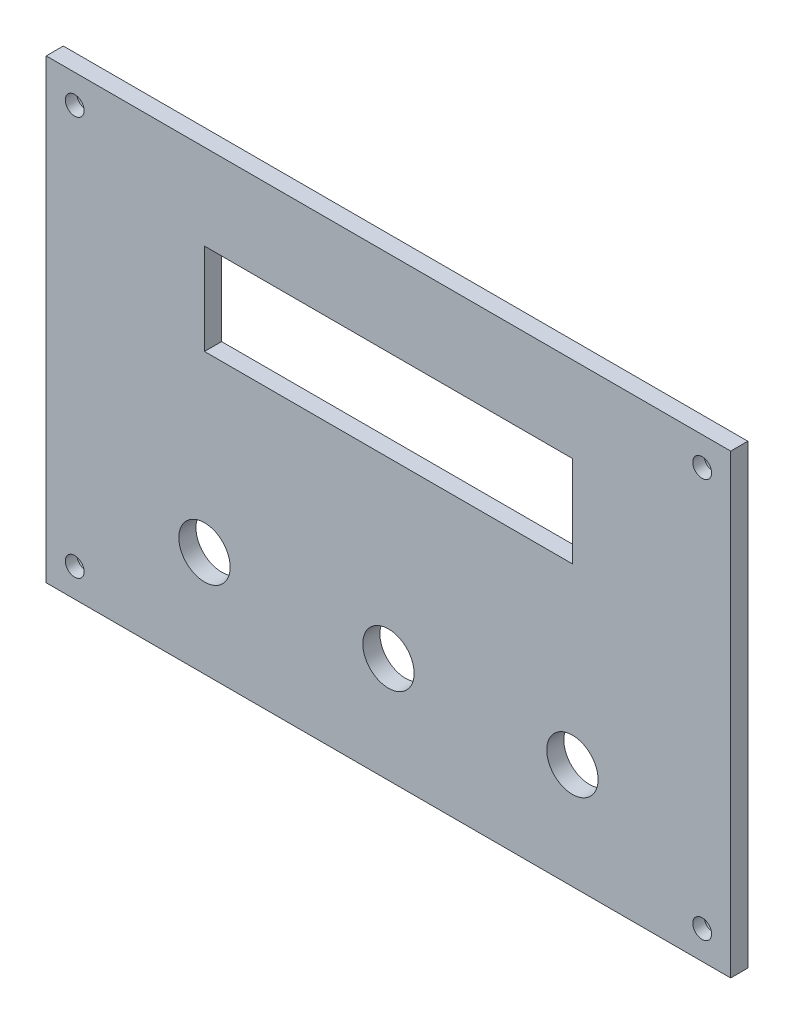
ISO-10303-21;
HEADER;
FILE_DESCRIPTION(('STEP AP214'),'2;1');
FILE_NAME('part.step','',(''),(''),'','','');
FILE_SCHEMA(('AUTOMOTIVE_DESIGN { 1 0 10303 214 1 1 1 1 }'));
ENDSEC;
DATA;
#1=APPLICATION_CONTEXT('core data for automotive mechanical design processes');
#2=APPLICATION_PROTOCOL_DEFINITION('international standard','automotive_design',2000,#1);
#3=PRODUCT_CONTEXT('',#1,'mechanical');
#4=PRODUCT('Part','Part','',(#3));
#5=PRODUCT_RELATED_PRODUCT_CATEGORY('part','',(#4));
#6=PRODUCT_DEFINITION_FORMATION('','',#4);
#7=PRODUCT_DEFINITION_CONTEXT('part definition',#1,'design');
#8=PRODUCT_DEFINITION('design','',#6,#7);
#9=PRODUCT_DEFINITION_SHAPE('','',#8);
#10=(LENGTH_UNIT() NAMED_UNIT(*) SI_UNIT(.MILLI.,.METRE.));
#11=(NAMED_UNIT(*) PLANE_ANGLE_UNIT() SI_UNIT($,.RADIAN.));
#12=(NAMED_UNIT(*) SI_UNIT($,.STERADIAN.) SOLID_ANGLE_UNIT());
#13=UNCERTAINTY_MEASURE_WITH_UNIT(LENGTH_MEASURE(1.E-05),#10,'distance_accuracy_value','');
#14=(GEOMETRIC_REPRESENTATION_CONTEXT(3) GLOBAL_UNCERTAINTY_ASSIGNED_CONTEXT((#13)) GLOBAL_UNIT_ASSIGNED_CONTEXT((#10,
#11,#12)) REPRESENTATION_CONTEXT('',''));
#15=CARTESIAN_POINT('',(0.,0.,0.));
#16=DIRECTION('',(0.,0.,1.));
#17=DIRECTION('',(1.,0.,0.));
#18=AXIS2_PLACEMENT_3D('',#15,#16,#17);
#19=CARTESIAN_POINT('',(0.,0.,3.));
#20=DIRECTION('',(0.,0.,1.));
#21=DIRECTION('',(1.,0.,0.));
#22=AXIS2_PLACEMENT_3D('',#19,#20,#21);
#23=PLANE('',#22);
#24=CARTESIAN_POINT('',(-55.,-35.,3.));
#25=DIRECTION('',(0.,0.,1.));
#26=DIRECTION('',(1.,0.,0.));
#27=AXIS2_PLACEMENT_3D('',#24,#25,#26);
#28=CIRCLE('',#27,1.65);
#29=CARTESIAN_POINT('',(-53.35,-35.,3.));
#30=VERTEX_POINT('',#29);
#31=EDGE_CURVE('E546',#30,#30,#28,.T.);
#32=ORIENTED_EDGE('',*,*,#31,.F.);
#33=EDGE_LOOP('',(#32));
#34=FACE_BOUND('',#33,.T.);
#35=CARTESIAN_POINT('',(55.,-35.,3.));
#36=DIRECTION('',(0.,0.,1.));
#37=DIRECTION('',(1.,0.,0.));
#38=AXIS2_PLACEMENT_3D('',#35,#36,#37);
#39=CIRCLE('',#38,1.65);
#40=CARTESIAN_POINT('',(56.65,-35.,3.));
#41=VERTEX_POINT('',#40);
#42=EDGE_CURVE('E537',#41,#41,#39,.T.);
#43=ORIENTED_EDGE('',*,*,#42,.F.);
#44=EDGE_LOOP('',(#43));
#45=FACE_BOUND('',#44,.T.);
#46=CARTESIAN_POINT('',(55.,35.,3.));
#47=DIRECTION('',(0.,0.,1.));
#48=DIRECTION('',(1.,0.,0.));
#49=AXIS2_PLACEMENT_3D('',#46,#47,#48);
#50=CIRCLE('',#49,1.65);
#51=CARTESIAN_POINT('',(56.65,35.,3.));
#52=VERTEX_POINT('',#51);
#53=EDGE_CURVE('E532',#52,#52,#50,.T.);
#54=ORIENTED_EDGE('',*,*,#53,.F.);
#55=EDGE_LOOP('',(#54));
#56=FACE_BOUND('',#55,.T.);
#57=CARTESIAN_POINT('',(-55.,35.,3.));
#58=DIRECTION('',(0.,0.,1.));
#59=DIRECTION('',(1.,0.,0.));
#60=AXIS2_PLACEMENT_3D('',#57,#58,#59);
#61=CIRCLE('',#60,1.65);
#62=CARTESIAN_POINT('',(-53.35,35.,3.));
#63=VERTEX_POINT('',#62);
#64=EDGE_CURVE('E536',#63,#63,#61,.T.);
#65=ORIENTED_EDGE('',*,*,#64,.F.);
#66=EDGE_LOOP('',(#65));
#67=FACE_BOUND('',#66,.T.);
#68=CARTESIAN_POINT('',(0.,-21.5,3.));
#69=DIRECTION('',(0.,0.,1.));
#70=DIRECTION('',(1.,0.,0.));
#71=AXIS2_PLACEMENT_3D('',#68,#69,#70);
#72=CIRCLE('',#71,4.5);
#73=CARTESIAN_POINT('',(4.5,-21.5,3.));
#74=VERTEX_POINT('',#73);
#75=EDGE_CURVE('E577',#74,#74,#72,.T.);
#76=ORIENTED_EDGE('',*,*,#75,.F.);
#77=EDGE_LOOP('',(#76));
#78=FACE_BOUND('',#77,.T.);
#79=DIRECTION('',(-1.,0.,0.));
#80=VECTOR('',#79,1.);
#81=CARTESIAN_POINT('',(-32.25,25.,3.));
#82=LINE('',#81,#80);
#83=CARTESIAN_POINT('',(32.25,25.,3.));
#84=VERTEX_POINT('',#83);
#85=CARTESIAN_POINT('',(-32.25,25.,3.));
#86=VERTEX_POINT('',#85);
#87=EDGE_CURVE('E119',#84,#86,#82,.T.);
#88=ORIENTED_EDGE('',*,*,#87,.F.);
#89=DIRECTION('',(0.,1.,0.));
#90=VECTOR('',#89,1.);
#91=CARTESIAN_POINT('',(32.25,25.,3.));
#92=LINE('',#91,#90);
#93=CARTESIAN_POINT('',(32.25,9.00000000000001,3.));
#94=VERTEX_POINT('',#93);
#95=EDGE_CURVE('E110',#94,#84,#92,.T.);
#96=ORIENTED_EDGE('',*,*,#95,.F.);
#97=DIRECTION('',(1.,0.,0.));
#98=VECTOR('',#97,1.);
#99=CARTESIAN_POINT('',(-32.25,9.00000000000001,3.));
#100=LINE('',#99,#98);
#101=CARTESIAN_POINT('',(-32.25,9.00000000000001,3.));
#102=VERTEX_POINT('',#101);
#103=EDGE_CURVE('E137',#102,#94,#100,.T.);
#104=ORIENTED_EDGE('',*,*,#103,.F.);
#105=DIRECTION('',(0.,-1.,0.));
#106=VECTOR('',#105,1.);
#107=CARTESIAN_POINT('',(-32.25,25.,3.));
#108=LINE('',#107,#106);
#109=EDGE_CURVE('E133',#86,#102,#108,.T.);
#110=ORIENTED_EDGE('',*,*,#109,.F.);
#111=EDGE_LOOP('',(#88,#96,#104,#110));
#112=FACE_BOUND('',#111,.T.);
#113=DIRECTION('',(0.,-1.,0.));
#114=VECTOR('',#113,1.);
#115=CARTESIAN_POINT('',(-60.,40.,3.));
#116=LINE('',#115,#114);
#117=CARTESIAN_POINT('',(-60.,40.,3.));
#118=VERTEX_POINT('',#117);
#119=CARTESIAN_POINT('',(-60.,-40.,3.));
#120=VERTEX_POINT('',#119);
#121=EDGE_CURVE('E161',#118,#120,#116,.T.);
#122=ORIENTED_EDGE('',*,*,#121,.T.);
#123=DIRECTION('',(1.,0.,0.));
#124=VECTOR('',#123,1.);
#125=CARTESIAN_POINT('',(-60.,-40.,3.));
#126=LINE('',#125,#124);
#127=CARTESIAN_POINT('',(60.,-40.,3.));
#128=VERTEX_POINT('',#127);
#129=EDGE_CURVE('E165',#120,#128,#126,.T.);
#130=ORIENTED_EDGE('',*,*,#129,.T.);
#131=DIRECTION('',(0.,-1.,0.));
#132=VECTOR('',#131,1.);
#133=CARTESIAN_POINT('',(60.,40.,3.));
#134=LINE('',#133,#132);
#135=CARTESIAN_POINT('',(60.,40.,3.));
#136=VERTEX_POINT('',#135);
#137=EDGE_CURVE('E169',#136,#128,#134,.T.);
#138=ORIENTED_EDGE('',*,*,#137,.F.);
#139=DIRECTION('',(1.,0.,0.));
#140=VECTOR('',#139,1.);
#141=CARTESIAN_POINT('',(-60.,40.,3.));
#142=LINE('',#141,#140);
#143=EDGE_CURVE('E173',#118,#136,#142,.T.);
#144=ORIENTED_EDGE('',*,*,#143,.F.);
#145=EDGE_LOOP('',(#122,#130,#138,#144));
#146=FACE_BOUND('',#145,.T.);
#147=CARTESIAN_POINT('',(32.25,-21.5,3.));
#148=DIRECTION('',(0.,0.,1.));
#149=DIRECTION('',(1.,0.,0.));
#150=AXIS2_PLACEMENT_3D('',#147,#148,#149);
#151=CIRCLE('',#150,4.5);
#152=CARTESIAN_POINT('',(36.75,-21.5,3.));
#153=VERTEX_POINT('',#152);
#154=EDGE_CURVE('E562',#153,#153,#151,.T.);
#155=ORIENTED_EDGE('',*,*,#154,.F.);
#156=EDGE_LOOP('',(#155));
#157=FACE_BOUND('',#156,.T.);
#158=CARTESIAN_POINT('',(-32.25,-21.5,3.));
#159=DIRECTION('',(0.,0.,1.));
#160=DIRECTION('',(1.,0.,0.));
#161=AXIS2_PLACEMENT_3D('',#158,#159,#160);
#162=CIRCLE('',#161,4.5);
#163=CARTESIAN_POINT('',(-27.75,-21.5,3.));
#164=VERTEX_POINT('',#163);
#165=EDGE_CURVE('E145',#164,#164,#162,.T.);
#166=ORIENTED_EDGE('',*,*,#165,.F.);
#167=EDGE_LOOP('',(#166));
#168=FACE_BOUND('',#167,.T.);
#169=ADVANCED_FACE('F44',(#34,#45,#56,#67,#78,#112,#146,#157,#168),#23,.T.);
#170=CARTESIAN_POINT('',(0.,0.,0.));
#171=DIRECTION('',(0.,0.,1.));
#172=DIRECTION('',(1.,0.,0.));
#173=AXIS2_PLACEMENT_3D('',#170,#171,#172);
#174=PLANE('',#173);
#175=CARTESIAN_POINT('',(55.,-35.,0.));
#176=DIRECTION('',(0.,0.,1.));
#177=DIRECTION('',(1.,0.,0.));
#178=AXIS2_PLACEMENT_3D('',#175,#176,#177);
#179=CIRCLE('',#178,2.5);
#180=CARTESIAN_POINT('',(57.5,-35.,0.));
#181=VERTEX_POINT('',#180);
#182=EDGE_CURVE('E511',#181,#181,#179,.T.);
#183=ORIENTED_EDGE('',*,*,#182,.T.);
#184=EDGE_LOOP('',(#183));
#185=FACE_BOUND('',#184,.T.);
#186=CARTESIAN_POINT('',(-55.,-35.,0.));
#187=DIRECTION('',(0.,0.,1.));
#188=DIRECTION('',(1.,0.,0.));
#189=AXIS2_PLACEMENT_3D('',#186,#187,#188);
#190=CIRCLE('',#189,2.5);
#191=CARTESIAN_POINT('',(-52.5,-35.,0.));
#192=VERTEX_POINT('',#191);
#193=EDGE_CURVE('E510',#192,#192,#190,.T.);
#194=ORIENTED_EDGE('',*,*,#193,.T.);
#195=EDGE_LOOP('',(#194));
#196=FACE_BOUND('',#195,.T.);
#197=CARTESIAN_POINT('',(-55.,35.,0.));
#198=DIRECTION('',(0.,0.,1.));
#199=DIRECTION('',(1.,0.,0.));
#200=AXIS2_PLACEMENT_3D('',#197,#198,#199);
#201=CIRCLE('',#200,2.5);
#202=CARTESIAN_POINT('',(-52.5,35.,0.));
#203=VERTEX_POINT('',#202);
#204=EDGE_CURVE('E591',#203,#203,#201,.T.);
#205=ORIENTED_EDGE('',*,*,#204,.T.);
#206=EDGE_LOOP('',(#205));
#207=FACE_BOUND('',#206,.T.);
#208=CARTESIAN_POINT('',(55.,35.,0.));
#209=DIRECTION('',(0.,0.,1.));
#210=DIRECTION('',(1.,0.,0.));
#211=AXIS2_PLACEMENT_3D('',#208,#209,#210);
#212=CIRCLE('',#211,2.5);
#213=CARTESIAN_POINT('',(57.5,35.,0.));
#214=VERTEX_POINT('',#213);
#215=EDGE_CURVE('E522',#214,#214,#212,.T.);
#216=ORIENTED_EDGE('',*,*,#215,.T.);
#217=EDGE_LOOP('',(#216));
#218=FACE_BOUND('',#217,.T.);
#219=DIRECTION('',(0.,-1.,0.));
#220=VECTOR('',#219,1.);
#221=CARTESIAN_POINT('',(-60.,40.,0.));
#222=LINE('',#221,#220);
#223=CARTESIAN_POINT('',(-60.,40.,0.));
#224=VERTEX_POINT('',#223);
#225=CARTESIAN_POINT('',(-60.,-40.,0.));
#226=VERTEX_POINT('',#225);
#227=EDGE_CURVE('E128',#224,#226,#222,.T.);
#228=ORIENTED_EDGE('',*,*,#227,.F.);
#229=DIRECTION('',(1.,0.,0.));
#230=VECTOR('',#229,1.);
#231=CARTESIAN_POINT('',(-60.,40.,0.));
#232=LINE('',#231,#230);
#233=CARTESIAN_POINT('',(60.,40.,0.));
#234=VERTEX_POINT('',#233);
#235=EDGE_CURVE('E166',#224,#234,#232,.T.);
#236=ORIENTED_EDGE('',*,*,#235,.T.);
#237=DIRECTION('',(0.,-1.,0.));
#238=VECTOR('',#237,1.);
#239=CARTESIAN_POINT('',(60.,40.,0.));
#240=LINE('',#239,#238);
#241=CARTESIAN_POINT('',(60.,-40.,0.));
#242=VERTEX_POINT('',#241);
#243=EDGE_CURVE('E185',#234,#242,#240,.T.);
#244=ORIENTED_EDGE('',*,*,#243,.T.);
#245=DIRECTION('',(1.,0.,0.));
#246=VECTOR('',#245,1.);
#247=CARTESIAN_POINT('',(-60.,-40.,0.));
#248=LINE('',#247,#246);
#249=EDGE_CURVE('E181',#226,#242,#248,.T.);
#250=ORIENTED_EDGE('',*,*,#249,.F.);
#251=EDGE_LOOP('',(#228,#236,#244,#250));
#252=FACE_BOUND('',#251,.T.);
#253=DIRECTION('',(0.,1.,0.));
#254=VECTOR('',#253,1.);
#255=CARTESIAN_POINT('',(32.25,25.,0.));
#256=LINE('',#255,#254);
#257=CARTESIAN_POINT('',(32.25,9.00000000000001,0.));
#258=VERTEX_POINT('',#257);
#259=CARTESIAN_POINT('',(32.25,25.,0.));
#260=VERTEX_POINT('',#259);
#261=EDGE_CURVE('E68',#258,#260,#256,.T.);
#262=ORIENTED_EDGE('',*,*,#261,.T.);
#263=DIRECTION('',(-1.,0.,0.));
#264=VECTOR('',#263,1.);
#265=CARTESIAN_POINT('',(-32.25,25.,0.));
#266=LINE('',#265,#264);
#267=CARTESIAN_POINT('',(-32.25,25.,0.));
#268=VERTEX_POINT('',#267);
#269=EDGE_CURVE('E126',#260,#268,#266,.T.);
#270=ORIENTED_EDGE('',*,*,#269,.T.);
#271=DIRECTION('',(0.,-1.,0.));
#272=VECTOR('',#271,1.);
#273=CARTESIAN_POINT('',(-32.25,25.,0.));
#274=LINE('',#273,#272);
#275=CARTESIAN_POINT('',(-32.25,9.00000000000001,0.));
#276=VERTEX_POINT('',#275);
#277=EDGE_CURVE('E148',#268,#276,#274,.T.);
#278=ORIENTED_EDGE('',*,*,#277,.T.);
#279=DIRECTION('',(1.,0.,0.));
#280=VECTOR('',#279,1.);
#281=CARTESIAN_POINT('',(-32.25,9.00000000000001,0.));
#282=LINE('',#281,#280);
#283=EDGE_CURVE('E120',#276,#258,#282,.T.);
#284=ORIENTED_EDGE('',*,*,#283,.T.);
#285=EDGE_LOOP('',(#262,#270,#278,#284));
#286=FACE_BOUND('',#285,.T.);
#287=CARTESIAN_POINT('',(32.25,-21.5,0.));
#288=DIRECTION('',(0.,0.,1.));
#289=DIRECTION('',(1.,0.,0.));
#290=AXIS2_PLACEMENT_3D('',#287,#288,#289);
#291=CIRCLE('',#290,4.5);
#292=CARTESIAN_POINT('',(36.75,-21.5,0.));
#293=VERTEX_POINT('',#292);
#294=EDGE_CURVE('E561',#293,#293,#291,.T.);
#295=ORIENTED_EDGE('',*,*,#294,.T.);
#296=EDGE_LOOP('',(#295));
#297=FACE_BOUND('',#296,.T.);
#298=CARTESIAN_POINT('',(0.,-21.5,0.));
#299=DIRECTION('',(0.,0.,1.));
#300=DIRECTION('',(1.,0.,0.));
#301=AXIS2_PLACEMENT_3D('',#298,#299,#300);
#302=CIRCLE('',#301,4.5);
#303=CARTESIAN_POINT('',(4.5,-21.5,0.));
#304=VERTEX_POINT('',#303);
#305=EDGE_CURVE('E566',#304,#304,#302,.T.);
#306=ORIENTED_EDGE('',*,*,#305,.T.);
#307=EDGE_LOOP('',(#306));
#308=FACE_BOUND('',#307,.T.);
#309=CARTESIAN_POINT('',(-32.25,-21.5,0.));
#310=DIRECTION('',(0.,0.,1.));
#311=DIRECTION('',(1.,0.,0.));
#312=AXIS2_PLACEMENT_3D('',#309,#310,#311);
#313=CIRCLE('',#312,4.5);
#314=CARTESIAN_POINT('',(-27.75,-21.5,0.));
#315=VERTEX_POINT('',#314);
#316=EDGE_CURVE('E573',#315,#315,#313,.T.);
#317=ORIENTED_EDGE('',*,*,#316,.T.);
#318=EDGE_LOOP('',(#317));
#319=FACE_BOUND('',#318,.T.);
#320=ADVANCED_FACE('F207',(#185,#196,#207,#218,#252,#286,#297,#308,#319),#174,.F.);
#321=CARTESIAN_POINT('',(-60.,40.,3.));
#322=DIRECTION('',(1.,0.,0.));
#323=DIRECTION('',(0.,1.,0.));
#324=AXIS2_PLACEMENT_3D('',#321,#322,#323);
#325=PLANE('',#324);
#326=ORIENTED_EDGE('',*,*,#227,.T.);
#327=DIRECTION('',(0.,0.,-1.));
#328=VECTOR('',#327,1.);
#329=CARTESIAN_POINT('',(-60.,-40.,3.));
#330=LINE('',#329,#328);
#331=EDGE_CURVE('E12',#120,#226,#330,.T.);
#332=ORIENTED_EDGE('',*,*,#331,.F.);
#333=ORIENTED_EDGE('',*,*,#121,.F.);
#334=DIRECTION('',(0.,0.,-1.));
#335=VECTOR('',#334,1.);
#336=CARTESIAN_POINT('',(-60.,40.,3.));
#337=LINE('',#336,#335);
#338=EDGE_CURVE('E177',#118,#224,#337,.T.);
#339=ORIENTED_EDGE('',*,*,#338,.T.);
#340=EDGE_LOOP('',(#326,#332,#333,#339));
#341=FACE_BOUND('',#340,.T.);
#342=ADVANCED_FACE('F46',(#341),#325,.F.);
#343=CARTESIAN_POINT('',(-60.,-40.,3.));
#344=DIRECTION('',(0.,1.,0.));
#345=DIRECTION('',(0.,0.,1.));
#346=AXIS2_PLACEMENT_3D('',#343,#344,#345);
#347=PLANE('',#346);
#348=ORIENTED_EDGE('',*,*,#249,.T.);
#349=DIRECTION('',(0.,0.,-1.));
#350=VECTOR('',#349,1.);
#351=CARTESIAN_POINT('',(60.,-40.,3.));
#352=LINE('',#351,#350);
#353=EDGE_CURVE('E53',#128,#242,#352,.T.);
#354=ORIENTED_EDGE('',*,*,#353,.F.);
#355=ORIENTED_EDGE('',*,*,#129,.F.);
#356=ORIENTED_EDGE('',*,*,#331,.T.);
#357=EDGE_LOOP('',(#348,#354,#355,#356));
#358=FACE_BOUND('',#357,.T.);
#359=ADVANCED_FACE('F203',(#358),#347,.F.);
#360=CARTESIAN_POINT('',(60.,40.,3.));
#361=DIRECTION('',(1.,0.,0.));
#362=DIRECTION('',(0.,1.,0.));
#363=AXIS2_PLACEMENT_3D('',#360,#361,#362);
#364=PLANE('',#363);
#365=ORIENTED_EDGE('',*,*,#243,.F.);
#366=DIRECTION('',(0.,0.,-1.));
#367=VECTOR('',#366,1.);
#368=CARTESIAN_POINT('',(60.,40.,3.));
#369=LINE('',#368,#367);
#370=EDGE_CURVE('E194',#136,#234,#369,.T.);
#371=ORIENTED_EDGE('',*,*,#370,.F.);
#372=ORIENTED_EDGE('',*,*,#137,.T.);
#373=ORIENTED_EDGE('',*,*,#353,.T.);
#374=EDGE_LOOP('',(#365,#371,#372,#373));
#375=FACE_BOUND('',#374,.T.);
#376=ADVANCED_FACE('F200',(#375),#364,.T.);
#377=CARTESIAN_POINT('',(-60.,40.,3.));
#378=DIRECTION('',(0.,1.,0.));
#379=DIRECTION('',(0.,0.,1.));
#380=AXIS2_PLACEMENT_3D('',#377,#378,#379);
#381=PLANE('',#380);
#382=ORIENTED_EDGE('',*,*,#235,.F.);
#383=ORIENTED_EDGE('',*,*,#338,.F.);
#384=ORIENTED_EDGE('',*,*,#143,.T.);
#385=ORIENTED_EDGE('',*,*,#370,.T.);
#386=EDGE_LOOP('',(#382,#383,#384,#385));
#387=FACE_BOUND('',#386,.T.);
#388=ADVANCED_FACE('F211',(#387),#381,.T.);
#389=CARTESIAN_POINT('',(32.25,25.,3.));
#390=DIRECTION('',(-1.,0.,0.));
#391=DIRECTION('',(0.,0.,1.));
#392=AXIS2_PLACEMENT_3D('',#389,#390,#391);
#393=PLANE('',#392);
#394=ORIENTED_EDGE('',*,*,#261,.F.);
#395=DIRECTION('',(0.,0.,-1.));
#396=VECTOR('',#395,1.);
#397=CARTESIAN_POINT('',(32.25,9.00000000000001,3.));
#398=LINE('',#397,#396);
#399=EDGE_CURVE('E114',#94,#258,#398,.T.);
#400=ORIENTED_EDGE('',*,*,#399,.F.);
#401=ORIENTED_EDGE('',*,*,#95,.T.);
#402=DIRECTION('',(0.,0.,-1.));
#403=VECTOR('',#402,1.);
#404=CARTESIAN_POINT('',(32.25,25.,3.));
#405=LINE('',#404,#403);
#406=EDGE_CURVE('E113',#84,#260,#405,.T.);
#407=ORIENTED_EDGE('',*,*,#406,.T.);
#408=EDGE_LOOP('',(#394,#400,#401,#407));
#409=FACE_BOUND('',#408,.T.);
#410=ADVANCED_FACE('F112',(#409),#393,.T.);
#411=CARTESIAN_POINT('',(-32.25,25.,3.));
#412=DIRECTION('',(0.,-1.,0.));
#413=DIRECTION('',(0.,0.,-1.));
#414=AXIS2_PLACEMENT_3D('',#411,#412,#413);
#415=PLANE('',#414);
#416=ORIENTED_EDGE('',*,*,#269,.F.);
#417=ORIENTED_EDGE('',*,*,#406,.F.);
#418=ORIENTED_EDGE('',*,*,#87,.T.);
#419=DIRECTION('',(0.,0.,-1.));
#420=VECTOR('',#419,1.);
#421=CARTESIAN_POINT('',(-32.25,25.,3.));
#422=LINE('',#421,#420);
#423=EDGE_CURVE('E129',#86,#268,#422,.T.);
#424=ORIENTED_EDGE('',*,*,#423,.T.);
#425=EDGE_LOOP('',(#416,#417,#418,#424));
#426=FACE_BOUND('',#425,.T.);
#427=ADVANCED_FACE('F123',(#426),#415,.T.);
#428=CARTESIAN_POINT('',(-32.25,25.,3.));
#429=DIRECTION('',(1.,0.,0.));
#430=DIRECTION('',(0.,0.,-1.));
#431=AXIS2_PLACEMENT_3D('',#428,#429,#430);
#432=PLANE('',#431);
#433=ORIENTED_EDGE('',*,*,#277,.F.);
#434=ORIENTED_EDGE('',*,*,#423,.F.);
#435=ORIENTED_EDGE('',*,*,#109,.T.);
#436=DIRECTION('',(0.,0.,-1.));
#437=VECTOR('',#436,1.);
#438=CARTESIAN_POINT('',(-32.25,9.00000000000001,3.));
#439=LINE('',#438,#437);
#440=EDGE_CURVE('E60',#102,#276,#439,.T.);
#441=ORIENTED_EDGE('',*,*,#440,.T.);
#442=EDGE_LOOP('',(#433,#434,#435,#441));
#443=FACE_BOUND('',#442,.T.);
#444=ADVANCED_FACE('F255',(#443),#432,.T.);
#445=CARTESIAN_POINT('',(-32.25,9.00000000000001,3.));
#446=DIRECTION('',(0.,1.,0.));
#447=DIRECTION('',(0.,0.,1.));
#448=AXIS2_PLACEMENT_3D('',#445,#446,#447);
#449=PLANE('',#448);
#450=ORIENTED_EDGE('',*,*,#283,.F.);
#451=ORIENTED_EDGE('',*,*,#440,.F.);
#452=ORIENTED_EDGE('',*,*,#103,.T.);
#453=ORIENTED_EDGE('',*,*,#399,.T.);
#454=EDGE_LOOP('',(#450,#451,#452,#453));
#455=FACE_BOUND('',#454,.T.);
#456=ADVANCED_FACE('F261',(#455),#449,.T.);
#457=CARTESIAN_POINT('',(32.25,-21.5,3.));
#458=DIRECTION('',(0.,0.,-1.));
#459=DIRECTION('',(-1.,0.,0.));
#460=AXIS2_PLACEMENT_3D('',#457,#458,#459);
#461=CYLINDRICAL_SURFACE('',#460,4.5);
#462=ORIENTED_EDGE('',*,*,#154,.T.);
#463=EDGE_LOOP('',(#462));
#464=FACE_BOUND('',#463,.T.);
#465=ORIENTED_EDGE('',*,*,#294,.F.);
#466=EDGE_LOOP('',(#465));
#467=FACE_BOUND('',#466,.T.);
#468=ADVANCED_FACE('F269',(#464,#467),#461,.F.);
#469=CARTESIAN_POINT('',(0.,-21.5,3.));
#470=DIRECTION('',(0.,0.,-1.));
#471=DIRECTION('',(-1.,0.,0.));
#472=AXIS2_PLACEMENT_3D('',#469,#470,#471);
#473=CYLINDRICAL_SURFACE('',#472,4.5);
#474=ORIENTED_EDGE('',*,*,#75,.T.);
#475=EDGE_LOOP('',(#474));
#476=FACE_BOUND('',#475,.T.);
#477=ORIENTED_EDGE('',*,*,#305,.F.);
#478=EDGE_LOOP('',(#477));
#479=FACE_BOUND('',#478,.T.);
#480=ADVANCED_FACE('F276',(#476,#479),#473,.F.);
#481=CARTESIAN_POINT('',(-32.25,-21.5,3.));
#482=DIRECTION('',(0.,0.,-1.));
#483=DIRECTION('',(-1.,0.,0.));
#484=AXIS2_PLACEMENT_3D('',#481,#482,#483);
#485=CYLINDRICAL_SURFACE('',#484,4.5);
#486=ORIENTED_EDGE('',*,*,#165,.T.);
#487=EDGE_LOOP('',(#486));
#488=FACE_BOUND('',#487,.T.);
#489=ORIENTED_EDGE('',*,*,#316,.F.);
#490=EDGE_LOOP('',(#489));
#491=FACE_BOUND('',#490,.T.);
#492=ADVANCED_FACE('F284',(#488,#491),#485,.F.);
#493=CARTESIAN_POINT('',(-55.,35.,1.));
#494=DIRECTION('',(0.,0.,1.));
#495=DIRECTION('',(1.,0.,0.));
#496=AXIS2_PLACEMENT_3D('',#493,#494,#495);
#497=CYLINDRICAL_SURFACE('',#496,1.65);
#498=CARTESIAN_POINT('',(-55.,35.,1.));
#499=DIRECTION('',(0.,0.,1.));
#500=DIRECTION('',(1.,0.,0.));
#501=AXIS2_PLACEMENT_3D('',#498,#499,#500);
#502=CIRCLE('',#501,1.65);
#503=CARTESIAN_POINT('',(-53.35,35.,1.));
#504=VERTEX_POINT('',#503);
#505=EDGE_CURVE('E542',#504,#504,#502,.T.);
#506=ORIENTED_EDGE('',*,*,#505,.F.);
#507=EDGE_LOOP('',(#506));
#508=FACE_BOUND('',#507,.T.);
#509=ORIENTED_EDGE('',*,*,#64,.T.);
#510=EDGE_LOOP('',(#509));
#511=FACE_BOUND('',#510,.T.);
#512=ADVANCED_FACE('F292',(#508,#511),#497,.F.);
#513=CARTESIAN_POINT('',(55.,35.,1.));
#514=DIRECTION('',(0.,0.,1.));
#515=DIRECTION('',(1.,0.,0.));
#516=AXIS2_PLACEMENT_3D('',#513,#514,#515);
#517=CYLINDRICAL_SURFACE('',#516,1.65);
#518=CARTESIAN_POINT('',(55.,35.,1.));
#519=DIRECTION('',(0.,0.,1.));
#520=DIRECTION('',(1.,0.,0.));
#521=AXIS2_PLACEMENT_3D('',#518,#519,#520);
#522=CIRCLE('',#521,1.65);
#523=CARTESIAN_POINT('',(56.65,35.,1.));
#524=VERTEX_POINT('',#523);
#525=EDGE_CURVE('E538',#524,#524,#522,.T.);
#526=ORIENTED_EDGE('',*,*,#525,.F.);
#527=EDGE_LOOP('',(#526));
#528=FACE_BOUND('',#527,.T.);
#529=ORIENTED_EDGE('',*,*,#53,.T.);
#530=EDGE_LOOP('',(#529));
#531=FACE_BOUND('',#530,.T.);
#532=ADVANCED_FACE('F300',(#528,#531),#517,.F.);
#533=CARTESIAN_POINT('',(55.,-35.,1.));
#534=DIRECTION('',(0.,0.,1.));
#535=DIRECTION('',(1.,0.,0.));
#536=AXIS2_PLACEMENT_3D('',#533,#534,#535);
#537=CYLINDRICAL_SURFACE('',#536,1.65);
#538=CARTESIAN_POINT('',(55.,-35.,1.));
#539=DIRECTION('',(0.,0.,1.));
#540=DIRECTION('',(1.,0.,0.));
#541=AXIS2_PLACEMENT_3D('',#538,#539,#540);
#542=CIRCLE('',#541,1.65);
#543=CARTESIAN_POINT('',(56.65,-35.,1.));
#544=VERTEX_POINT('',#543);
#545=EDGE_CURVE('E504',#544,#544,#542,.T.);
#546=ORIENTED_EDGE('',*,*,#545,.F.);
#547=EDGE_LOOP('',(#546));
#548=FACE_BOUND('',#547,.T.);
#549=ORIENTED_EDGE('',*,*,#42,.T.);
#550=EDGE_LOOP('',(#549));
#551=FACE_BOUND('',#550,.T.);
#552=ADVANCED_FACE('F308',(#548,#551),#537,.F.);
#553=CARTESIAN_POINT('',(-55.,-35.,1.));
#554=DIRECTION('',(0.,0.,1.));
#555=DIRECTION('',(1.,0.,0.));
#556=AXIS2_PLACEMENT_3D('',#553,#554,#555);
#557=CYLINDRICAL_SURFACE('',#556,1.65);
#558=CARTESIAN_POINT('',(-55.,-35.,1.));
#559=DIRECTION('',(0.,0.,1.));
#560=DIRECTION('',(1.,0.,0.));
#561=AXIS2_PLACEMENT_3D('',#558,#559,#560);
#562=CIRCLE('',#561,1.65);
#563=CARTESIAN_POINT('',(-53.35,-35.,1.));
#564=VERTEX_POINT('',#563);
#565=EDGE_CURVE('E526',#564,#564,#562,.T.);
#566=ORIENTED_EDGE('',*,*,#565,.F.);
#567=EDGE_LOOP('',(#566));
#568=FACE_BOUND('',#567,.T.);
#569=ORIENTED_EDGE('',*,*,#31,.T.);
#570=EDGE_LOOP('',(#569));
#571=FACE_BOUND('',#570,.T.);
#572=ADVANCED_FACE('F316',(#568,#571),#557,.F.);
#573=CARTESIAN_POINT('',(55.,35.,0.));
#574=DIRECTION('',(0.,0.,1.));
#575=DIRECTION('',(1.,0.,0.));
#576=AXIS2_PLACEMENT_3D('',#573,#574,#575);
#577=CYLINDRICAL_SURFACE('',#576,2.5);
#578=ORIENTED_EDGE('',*,*,#215,.F.);
#579=EDGE_LOOP('',(#578));
#580=FACE_BOUND('',#579,.T.);
#581=CARTESIAN_POINT('',(55.,35.,1.));
#582=DIRECTION('',(0.,0.,1.));
#583=DIRECTION('',(1.,0.,0.));
#584=AXIS2_PLACEMENT_3D('',#581,#582,#583);
#585=CIRCLE('',#584,2.5);
#586=CARTESIAN_POINT('',(57.5,35.,1.));
#587=VERTEX_POINT('',#586);
#588=EDGE_CURVE('E527',#587,#587,#585,.T.);
#589=ORIENTED_EDGE('',*,*,#588,.T.);
#590=EDGE_LOOP('',(#589));
#591=FACE_BOUND('',#590,.T.);
#592=ADVANCED_FACE('F324',(#580,#591),#577,.F.);
#593=CARTESIAN_POINT('',(55.,35.,1.));
#594=DIRECTION('',(0.,0.,1.));
#595=DIRECTION('',(1.,0.,0.));
#596=AXIS2_PLACEMENT_3D('',#593,#594,#595);
#597=PLANE('',#596);
#598=ORIENTED_EDGE('',*,*,#525,.T.);
#599=EDGE_LOOP('',(#598));
#600=FACE_BOUND('',#599,.T.);
#601=ORIENTED_EDGE('',*,*,#588,.F.);
#602=EDGE_LOOP('',(#601));
#603=FACE_BOUND('',#602,.T.);
#604=ADVANCED_FACE('F333',(#600,#603),#597,.F.);
#605=CARTESIAN_POINT('',(-55.,35.,0.));
#606=DIRECTION('',(0.,0.,1.));
#607=DIRECTION('',(1.,0.,0.));
#608=AXIS2_PLACEMENT_3D('',#605,#606,#607);
#609=CYLINDRICAL_SURFACE('',#608,2.5);
#610=ORIENTED_EDGE('',*,*,#204,.F.);
#611=EDGE_LOOP('',(#610));
#612=FACE_BOUND('',#611,.T.);
#613=CARTESIAN_POINT('',(-55.,35.,1.));
#614=DIRECTION('',(0.,0.,1.));
#615=DIRECTION('',(1.,0.,0.));
#616=AXIS2_PLACEMENT_3D('',#613,#614,#615);
#617=CIRCLE('',#616,2.5);
#618=CARTESIAN_POINT('',(-52.5,35.,1.));
#619=VERTEX_POINT('',#618);
#620=EDGE_CURVE('E531',#619,#619,#617,.T.);
#621=ORIENTED_EDGE('',*,*,#620,.T.);
#622=EDGE_LOOP('',(#621));
#623=FACE_BOUND('',#622,.T.);
#624=ADVANCED_FACE('F341',(#612,#623),#609,.F.);
#625=CARTESIAN_POINT('',(-55.,35.,1.));
#626=DIRECTION('',(0.,0.,1.));
#627=DIRECTION('',(1.,0.,0.));
#628=AXIS2_PLACEMENT_3D('',#625,#626,#627);
#629=PLANE('',#628);
#630=ORIENTED_EDGE('',*,*,#505,.T.);
#631=EDGE_LOOP('',(#630));
#632=FACE_BOUND('',#631,.T.);
#633=ORIENTED_EDGE('',*,*,#620,.F.);
#634=EDGE_LOOP('',(#633));
#635=FACE_BOUND('',#634,.T.);
#636=ADVANCED_FACE('F349',(#632,#635),#629,.F.);
#637=CARTESIAN_POINT('',(-55.,-35.,0.));
#638=DIRECTION('',(0.,0.,1.));
#639=DIRECTION('',(1.,0.,0.));
#640=AXIS2_PLACEMENT_3D('',#637,#638,#639);
#641=CYLINDRICAL_SURFACE('',#640,2.5);
#642=ORIENTED_EDGE('',*,*,#193,.F.);
#643=EDGE_LOOP('',(#642));
#644=FACE_BOUND('',#643,.T.);
#645=CARTESIAN_POINT('',(-55.,-35.,1.));
#646=DIRECTION('',(0.,0.,1.));
#647=DIRECTION('',(1.,0.,0.));
#648=AXIS2_PLACEMENT_3D('',#645,#646,#647);
#649=CIRCLE('',#648,2.5);
#650=CARTESIAN_POINT('',(-52.5,-35.,1.));
#651=VERTEX_POINT('',#650);
#652=EDGE_CURVE('E516',#651,#651,#649,.T.);
#653=ORIENTED_EDGE('',*,*,#652,.T.);
#654=EDGE_LOOP('',(#653));
#655=FACE_BOUND('',#654,.T.);
#656=ADVANCED_FACE('F357',(#644,#655),#641,.F.);
#657=CARTESIAN_POINT('',(-55.,-35.,1.));
#658=DIRECTION('',(0.,0.,1.));
#659=DIRECTION('',(1.,0.,0.));
#660=AXIS2_PLACEMENT_3D('',#657,#658,#659);
#661=PLANE('',#660);
#662=ORIENTED_EDGE('',*,*,#565,.T.);
#663=EDGE_LOOP('',(#662));
#664=FACE_BOUND('',#663,.T.);
#665=ORIENTED_EDGE('',*,*,#652,.F.);
#666=EDGE_LOOP('',(#665));
#667=FACE_BOUND('',#666,.T.);
#668=ADVANCED_FACE('F365',(#664,#667),#661,.F.);
#669=CARTESIAN_POINT('',(55.,-35.,0.));
#670=DIRECTION('',(0.,0.,1.));
#671=DIRECTION('',(1.,0.,0.));
#672=AXIS2_PLACEMENT_3D('',#669,#670,#671);
#673=CYLINDRICAL_SURFACE('',#672,2.5);
#674=ORIENTED_EDGE('',*,*,#182,.F.);
#675=EDGE_LOOP('',(#674));
#676=FACE_BOUND('',#675,.T.);
#677=CARTESIAN_POINT('',(55.,-35.,1.));
#678=DIRECTION('',(0.,0.,1.));
#679=DIRECTION('',(1.,0.,0.));
#680=AXIS2_PLACEMENT_3D('',#677,#678,#679);
#681=CIRCLE('',#680,2.5);
#682=CARTESIAN_POINT('',(57.5,-35.,1.));
#683=VERTEX_POINT('',#682);
#684=EDGE_CURVE('E507',#683,#683,#681,.T.);
#685=ORIENTED_EDGE('',*,*,#684,.T.);
#686=EDGE_LOOP('',(#685));
#687=FACE_BOUND('',#686,.T.);
#688=ADVANCED_FACE('F373',(#676,#687),#673,.F.);
#689=CARTESIAN_POINT('',(55.,-35.,1.));
#690=DIRECTION('',(0.,0.,1.));
#691=DIRECTION('',(1.,0.,0.));
#692=AXIS2_PLACEMENT_3D('',#689,#690,#691);
#693=PLANE('',#692);
#694=ORIENTED_EDGE('',*,*,#545,.T.);
#695=EDGE_LOOP('',(#694));
#696=FACE_BOUND('',#695,.T.);
#697=ORIENTED_EDGE('',*,*,#684,.F.);
#698=EDGE_LOOP('',(#697));
#699=FACE_BOUND('',#698,.T.);
#700=ADVANCED_FACE('F381',(#696,#699),#693,.F.);
#701=CLOSED_SHELL('',(#169,#320,#342,#359,#376,#388,#410,#427,#444,#456,#468,#480,#492,#512,
#532,#552,#572,#592,#604,#624,#636,#656,#668,#688,#700));
#702=MANIFOLD_SOLID_BREP('B2',#701);
#703=ADVANCED_BREP_SHAPE_REPRESENTATION('',(#18,#702),#14);
#704=SHAPE_DEFINITION_REPRESENTATION(#9,#703);
ENDSEC;
END-ISO-10303-21;
